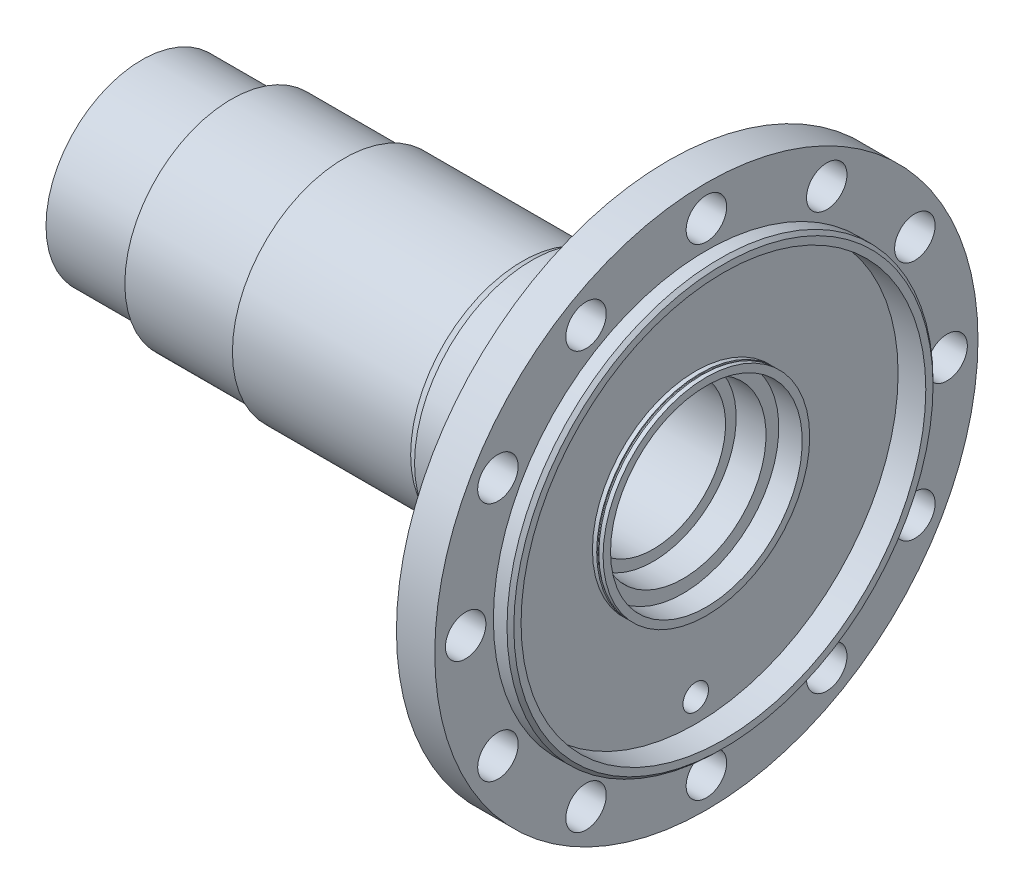
ISO-10303-21;
HEADER;
FILE_DESCRIPTION(('STEP AP214'),'2;1');
FILE_NAME('part.step','',(''),(''),'','','');
FILE_SCHEMA(('AUTOMOTIVE_DESIGN { 1 0 10303 214 1 1 1 1 }'));
ENDSEC;
DATA;
#1=APPLICATION_CONTEXT('core data for automotive mechanical design processes');
#2=APPLICATION_PROTOCOL_DEFINITION('international standard','automotive_design',2000,#1);
#3=PRODUCT_CONTEXT('',#1,'mechanical');
#4=PRODUCT('Part','Part','',(#3));
#5=PRODUCT_RELATED_PRODUCT_CATEGORY('part','',(#4));
#6=PRODUCT_DEFINITION_FORMATION('','',#4);
#7=PRODUCT_DEFINITION_CONTEXT('part definition',#1,'design');
#8=PRODUCT_DEFINITION('design','',#6,#7);
#9=PRODUCT_DEFINITION_SHAPE('','',#8);
#10=(LENGTH_UNIT() NAMED_UNIT(*) SI_UNIT(.MILLI.,.METRE.));
#11=(NAMED_UNIT(*) PLANE_ANGLE_UNIT() SI_UNIT($,.RADIAN.));
#12=(NAMED_UNIT(*) SI_UNIT($,.STERADIAN.) SOLID_ANGLE_UNIT());
#13=UNCERTAINTY_MEASURE_WITH_UNIT(LENGTH_MEASURE(1.E-05),#10,'distance_accuracy_value','');
#14=(GEOMETRIC_REPRESENTATION_CONTEXT(3) GLOBAL_UNCERTAINTY_ASSIGNED_CONTEXT((#13)) GLOBAL_UNIT_ASSIGNED_CONTEXT((#10,
#11,#12)) REPRESENTATION_CONTEXT('',''));
#15=CARTESIAN_POINT('',(0.,0.,0.));
#16=DIRECTION('',(0.,0.,1.));
#17=DIRECTION('',(1.,0.,0.));
#18=AXIS2_PLACEMENT_3D('',#15,#16,#17);
#19=CARTESIAN_POINT('',(265.,45.,0.));
#20=DIRECTION('',(1.,0.,0.));
#21=DIRECTION('',(0.,0.,-1.));
#22=AXIS2_PLACEMENT_3D('',#19,#20,#21);
#23=PLANE('',#22);
#24=CARTESIAN_POINT('',(265.,0.,0.));
#25=DIRECTION('',(-1.,0.,0.));
#26=DIRECTION('',(0.,0.,1.));
#27=AXIS2_PLACEMENT_3D('',#24,#25,#26);
#28=CIRCLE('',#27,45.);
#29=CARTESIAN_POINT('',(265.,0.,45.));
#30=VERTEX_POINT('',#29);
#31=EDGE_CURVE('E211',#30,#30,#28,.T.);
#32=ORIENTED_EDGE('',*,*,#31,.T.);
#33=EDGE_LOOP('',(#32));
#34=FACE_BOUND('',#33,.T.);
#35=CARTESIAN_POINT('',(265.,0.,0.));
#36=DIRECTION('',(-1.,0.,0.));
#37=DIRECTION('',(0.,0.,1.));
#38=AXIS2_PLACEMENT_3D('',#35,#36,#37);
#39=CIRCLE('',#38,48.5);
#40=CARTESIAN_POINT('',(265.,0.,48.5));
#41=VERTEX_POINT('',#40);
#42=EDGE_CURVE('E445',#41,#41,#39,.T.);
#43=ORIENTED_EDGE('',*,*,#42,.F.);
#44=EDGE_LOOP('',(#43));
#45=FACE_BOUND('',#44,.T.);
#46=ADVANCED_FACE('F50',(#34,#45),#23,.T.);
#47=CARTESIAN_POINT('',(0.,0.,0.));
#48=DIRECTION('',(1.,0.,0.));
#49=DIRECTION('',(0.,0.,-1.));
#50=AXIS2_PLACEMENT_3D('',#47,#48,#49);
#51=PLANE('',#50);
#52=CARTESIAN_POINT('',(0.,0.,0.));
#53=DIRECTION('',(-1.,0.,0.));
#54=DIRECTION('',(0.,0.,1.));
#55=AXIS2_PLACEMENT_3D('',#52,#53,#54);
#56=CIRCLE('',#55,31.);
#57=CARTESIAN_POINT('',(0.,0.,31.));
#58=VERTEX_POINT('',#57);
#59=EDGE_CURVE('E171',#58,#58,#56,.T.);
#60=ORIENTED_EDGE('',*,*,#59,.F.);
#61=EDGE_LOOP('',(#60));
#62=FACE_BOUND('',#61,.T.);
#63=CARTESIAN_POINT('',(0.,0.,0.));
#64=DIRECTION('',(-1.,0.,0.));
#65=DIRECTION('',(0.,0.,1.));
#66=AXIS2_PLACEMENT_3D('',#63,#64,#65);
#67=CIRCLE('',#66,45.);
#68=CARTESIAN_POINT('',(0.,0.,45.));
#69=VERTEX_POINT('',#68);
#70=EDGE_CURVE('E167',#69,#69,#67,.T.);
#71=ORIENTED_EDGE('',*,*,#70,.T.);
#72=EDGE_LOOP('',(#71));
#73=FACE_BOUND('',#72,.T.);
#74=ADVANCED_FACE('F53',(#62,#73),#51,.F.);
#75=CARTESIAN_POINT('',(273.,98.4,0.));
#76=DIRECTION('',(-1.,0.,0.));
#77=DIRECTION('',(0.,0.,1.));
#78=AXIS2_PLACEMENT_3D('',#75,#76,#77);
#79=PLANE('',#78);
#80=CARTESIAN_POINT('',(273.,0.,0.));
#81=DIRECTION('',(-1.,0.,0.));
#82=DIRECTION('',(0.,0.,1.));
#83=AXIS2_PLACEMENT_3D('',#80,#81,#82);
#84=CIRCLE('',#83,95.);
#85=CARTESIAN_POINT('',(273.,0.,95.));
#86=VERTEX_POINT('',#85);
#87=EDGE_CURVE('E215',#86,#86,#84,.T.);
#88=ORIENTED_EDGE('',*,*,#87,.T.);
#89=EDGE_LOOP('',(#88));
#90=FACE_BOUND('',#89,.T.);
#91=CARTESIAN_POINT('',(273.,0.,0.));
#92=DIRECTION('',(-1.,0.,0.));
#93=DIRECTION('',(0.,0.,1.));
#94=AXIS2_PLACEMENT_3D('',#91,#92,#93);
#95=CIRCLE('',#94,98.4);
#96=CARTESIAN_POINT('',(273.,0.,98.4));
#97=VERTEX_POINT('',#96);
#98=EDGE_CURVE('E11',#97,#97,#95,.T.);
#99=ORIENTED_EDGE('',*,*,#98,.F.);
#100=EDGE_LOOP('',(#99));
#101=FACE_BOUND('',#100,.T.);
#102=ADVANCED_FACE('F274',(#90,#101),#79,.F.);
#103=CARTESIAN_POINT('',(273.,0.,0.));
#104=DIRECTION('',(-1.,0.,0.));
#105=DIRECTION('',(0.,0.,1.));
#106=AXIS2_PLACEMENT_3D('',#103,#104,#105);
#107=CONICAL_SURFACE('',#106,98.4,0.785398163397435);
#108=CARTESIAN_POINT('',(271.4,0.,0.));
#109=DIRECTION('',(-1.,0.,0.));
#110=DIRECTION('',(0.,0.,1.));
#111=AXIS2_PLACEMENT_3D('',#108,#109,#110);
#112=CIRCLE('',#111,100.);
#113=CARTESIAN_POINT('',(271.4,0.,100.));
#114=VERTEX_POINT('',#113);
#115=EDGE_CURVE('E60',#114,#114,#112,.T.);
#116=ORIENTED_EDGE('',*,*,#115,.F.);
#117=EDGE_LOOP('',(#116));
#118=FACE_BOUND('',#117,.T.);
#119=ORIENTED_EDGE('',*,*,#98,.T.);
#120=EDGE_LOOP('',(#119));
#121=FACE_BOUND('',#120,.T.);
#122=ADVANCED_FACE('F400',(#118,#121),#107,.T.);
#123=CARTESIAN_POINT('',(0.,0.,0.));
#124=DIRECTION('',(-1.,0.,0.));
#125=DIRECTION('',(0.,0.,1.));
#126=AXIS2_PLACEMENT_3D('',#123,#124,#125);
#127=CYLINDRICAL_SURFACE('',#126,100.);
#128=CARTESIAN_POINT('',(265.,0.,0.));
#129=DIRECTION('',(-1.,0.,0.));
#130=DIRECTION('',(0.,0.,1.));
#131=AXIS2_PLACEMENT_3D('',#128,#129,#130);
#132=CIRCLE('',#131,100.);
#133=CARTESIAN_POINT('',(265.,0.,100.));
#134=VERTEX_POINT('',#133);
#135=EDGE_CURVE('E66',#134,#134,#132,.T.);
#136=ORIENTED_EDGE('',*,*,#135,.F.);
#137=EDGE_LOOP('',(#136));
#138=FACE_BOUND('',#137,.T.);
#139=ORIENTED_EDGE('',*,*,#115,.T.);
#140=EDGE_LOOP('',(#139));
#141=FACE_BOUND('',#140,.T.);
#142=ADVANCED_FACE('F395',(#138,#141),#127,.T.);
#143=CARTESIAN_POINT('',(265.,127.5,0.));
#144=DIRECTION('',(-1.,0.,0.));
#145=DIRECTION('',(0.,0.,1.));
#146=AXIS2_PLACEMENT_3D('',#143,#144,#145);
#147=PLANE('',#146);
#148=CARTESIAN_POINT('',(265.,97.8608706276416,-56.5));
#149=DIRECTION('',(-1.,0.,0.));
#150=DIRECTION('',(0.,0.,1.));
#151=AXIS2_PLACEMENT_3D('',#148,#149,#150);
#152=CIRCLE('',#151,9.5);
#153=CARTESIAN_POINT('',(265.,97.8608706276416,-47.));
#154=VERTEX_POINT('',#153);
#155=EDGE_CURVE('E506',#154,#154,#152,.F.);
#156=ORIENTED_EDGE('',*,*,#155,.F.);
#157=EDGE_LOOP('',(#156));
#158=FACE_BOUND('',#157,.T.);
#159=CARTESIAN_POINT('',(265.,56.4999999999999,-97.8608706276416));
#160=DIRECTION('',(-1.,0.,0.));
#161=DIRECTION('',(0.,0.,1.));
#162=AXIS2_PLACEMENT_3D('',#159,#160,#161);
#163=CIRCLE('',#162,9.49999999999999);
#164=CARTESIAN_POINT('',(265.,56.4999999999999,-88.3608706276416));
#165=VERTEX_POINT('',#164);
#166=EDGE_CURVE('E501',#165,#165,#163,.F.);
#167=ORIENTED_EDGE('',*,*,#166,.F.);
#168=EDGE_LOOP('',(#167));
#169=FACE_BOUND('',#168,.T.);
#170=CARTESIAN_POINT('',(265.,0.,-113.));
#171=DIRECTION('',(-1.,0.,0.));
#172=DIRECTION('',(0.,0.,1.));
#173=AXIS2_PLACEMENT_3D('',#170,#171,#172);
#174=CIRCLE('',#173,9.49999999999999);
#175=CARTESIAN_POINT('',(265.,0.,-103.5));
#176=VERTEX_POINT('',#175);
#177=EDGE_CURVE('E496',#176,#176,#174,.F.);
#178=ORIENTED_EDGE('',*,*,#177,.F.);
#179=EDGE_LOOP('',(#178));
#180=FACE_BOUND('',#179,.T.);
#181=CARTESIAN_POINT('',(265.,-56.5,-97.8608706276415));
#182=DIRECTION('',(-1.,0.,0.));
#183=DIRECTION('',(0.,0.,1.));
#184=AXIS2_PLACEMENT_3D('',#181,#182,#183);
#185=CIRCLE('',#184,9.49999999999999);
#186=CARTESIAN_POINT('',(265.,-56.5,-88.3608706276415));
#187=VERTEX_POINT('',#186);
#188=EDGE_CURVE('E491',#187,#187,#185,.F.);
#189=ORIENTED_EDGE('',*,*,#188,.F.);
#190=EDGE_LOOP('',(#189));
#191=FACE_BOUND('',#190,.T.);
#192=CARTESIAN_POINT('',(265.,-97.8608706276416,-56.5));
#193=DIRECTION('',(-1.,0.,0.));
#194=DIRECTION('',(0.,0.,1.));
#195=AXIS2_PLACEMENT_3D('',#192,#193,#194);
#196=CIRCLE('',#195,9.5);
#197=CARTESIAN_POINT('',(265.,-97.8608706276416,-47.));
#198=VERTEX_POINT('',#197);
#199=EDGE_CURVE('E486',#198,#198,#196,.F.);
#200=ORIENTED_EDGE('',*,*,#199,.F.);
#201=EDGE_LOOP('',(#200));
#202=FACE_BOUND('',#201,.T.);
#203=CARTESIAN_POINT('',(265.,-113.,0.));
#204=DIRECTION('',(-1.,0.,0.));
#205=DIRECTION('',(0.,0.,1.));
#206=AXIS2_PLACEMENT_3D('',#203,#204,#205);
#207=CIRCLE('',#206,9.5);
#208=CARTESIAN_POINT('',(265.,-113.,9.50000000000002));
#209=VERTEX_POINT('',#208);
#210=EDGE_CURVE('E481',#209,#209,#207,.F.);
#211=ORIENTED_EDGE('',*,*,#210,.F.);
#212=EDGE_LOOP('',(#211));
#213=FACE_BOUND('',#212,.T.);
#214=CARTESIAN_POINT('',(265.,-97.8608706276415,56.5));
#215=DIRECTION('',(-1.,0.,0.));
#216=DIRECTION('',(0.,0.,1.));
#217=AXIS2_PLACEMENT_3D('',#214,#215,#216);
#218=CIRCLE('',#217,9.5);
#219=CARTESIAN_POINT('',(265.,-97.8608706276415,66.0000000000001));
#220=VERTEX_POINT('',#219);
#221=EDGE_CURVE('E476',#220,#220,#218,.F.);
#222=ORIENTED_EDGE('',*,*,#221,.F.);
#223=EDGE_LOOP('',(#222));
#224=FACE_BOUND('',#223,.T.);
#225=CARTESIAN_POINT('',(265.,-56.5,97.8608706276416));
#226=DIRECTION('',(-1.,0.,0.));
#227=DIRECTION('',(0.,0.,1.));
#228=AXIS2_PLACEMENT_3D('',#225,#226,#227);
#229=CIRCLE('',#228,9.49999999999999);
#230=CARTESIAN_POINT('',(265.,-56.5,107.360870627642));
#231=VERTEX_POINT('',#230);
#232=EDGE_CURVE('E471',#231,#231,#229,.F.);
#233=ORIENTED_EDGE('',*,*,#232,.F.);
#234=EDGE_LOOP('',(#233));
#235=FACE_BOUND('',#234,.T.);
#236=CARTESIAN_POINT('',(265.,0.,113.));
#237=DIRECTION('',(-1.,0.,0.));
#238=DIRECTION('',(0.,0.,1.));
#239=AXIS2_PLACEMENT_3D('',#236,#237,#238);
#240=CIRCLE('',#239,9.49999999999999);
#241=CARTESIAN_POINT('',(265.,0.,122.5));
#242=VERTEX_POINT('',#241);
#243=EDGE_CURVE('E466',#242,#242,#240,.F.);
#244=ORIENTED_EDGE('',*,*,#243,.F.);
#245=EDGE_LOOP('',(#244));
#246=FACE_BOUND('',#245,.T.);
#247=CARTESIAN_POINT('',(265.,56.5,97.8608706276416));
#248=DIRECTION('',(-1.,0.,0.));
#249=DIRECTION('',(0.,0.,1.));
#250=AXIS2_PLACEMENT_3D('',#247,#248,#249);
#251=CIRCLE('',#250,9.49999999999999);
#252=CARTESIAN_POINT('',(265.,56.5,107.360870627642));
#253=VERTEX_POINT('',#252);
#254=EDGE_CURVE('E461',#253,#253,#251,.F.);
#255=ORIENTED_EDGE('',*,*,#254,.F.);
#256=EDGE_LOOP('',(#255));
#257=FACE_BOUND('',#256,.T.);
#258=CARTESIAN_POINT('',(265.,97.8608706276416,56.5));
#259=DIRECTION('',(-1.,0.,0.));
#260=DIRECTION('',(0.,0.,1.));
#261=AXIS2_PLACEMENT_3D('',#258,#259,#260);
#262=CIRCLE('',#261,9.5);
#263=CARTESIAN_POINT('',(265.,97.8608706276416,66.));
#264=VERTEX_POINT('',#263);
#265=EDGE_CURVE('E456',#264,#264,#262,.F.);
#266=ORIENTED_EDGE('',*,*,#265,.F.);
#267=EDGE_LOOP('',(#266));
#268=FACE_BOUND('',#267,.T.);
#269=CARTESIAN_POINT('',(265.,113.,0.));
#270=DIRECTION('',(-1.,0.,0.));
#271=DIRECTION('',(0.,0.,1.));
#272=AXIS2_PLACEMENT_3D('',#269,#270,#271);
#273=CIRCLE('',#272,9.5);
#274=CARTESIAN_POINT('',(265.,113.,9.49999999999999));
#275=VERTEX_POINT('',#274);
#276=EDGE_CURVE('E449',#275,#275,#273,.F.);
#277=ORIENTED_EDGE('',*,*,#276,.F.);
#278=EDGE_LOOP('',(#277));
#279=FACE_BOUND('',#278,.T.);
#280=CARTESIAN_POINT('',(265.,0.,0.));
#281=DIRECTION('',(-1.,0.,0.));
#282=DIRECTION('',(0.,0.,1.));
#283=AXIS2_PLACEMENT_3D('',#280,#281,#282);
#284=CIRCLE('',#283,127.5);
#285=CARTESIAN_POINT('',(265.,0.,127.5));
#286=VERTEX_POINT('',#285);
#287=EDGE_CURVE('E83',#286,#286,#284,.T.);
#288=ORIENTED_EDGE('',*,*,#287,.F.);
#289=EDGE_LOOP('',(#288));
#290=FACE_BOUND('',#289,.T.);
#291=ORIENTED_EDGE('',*,*,#135,.T.);
#292=EDGE_LOOP('',(#291));
#293=FACE_BOUND('',#292,.T.);
#294=ADVANCED_FACE('F390',(#158,#169,#180,#191,#202,#213,#224,#235,#246,#257,#268,#279,#290,
#293),#147,.F.);
#295=CARTESIAN_POINT('',(0.,0.,0.));
#296=DIRECTION('',(-1.,0.,0.));
#297=DIRECTION('',(0.,0.,1.));
#298=AXIS2_PLACEMENT_3D('',#295,#296,#297);
#299=CYLINDRICAL_SURFACE('',#298,127.5);
#300=CARTESIAN_POINT('',(247.,0.,0.));
#301=DIRECTION('',(-1.,0.,0.));
#302=DIRECTION('',(0.,0.,1.));
#303=AXIS2_PLACEMENT_3D('',#300,#301,#302);
#304=CIRCLE('',#303,127.5);
#305=CARTESIAN_POINT('',(247.,0.,127.5));
#306=VERTEX_POINT('',#305);
#307=EDGE_CURVE('E88',#306,#306,#304,.T.);
#308=ORIENTED_EDGE('',*,*,#307,.F.);
#309=EDGE_LOOP('',(#308));
#310=FACE_BOUND('',#309,.T.);
#311=ORIENTED_EDGE('',*,*,#287,.T.);
#312=EDGE_LOOP('',(#311));
#313=FACE_BOUND('',#312,.T.);
#314=ADVANCED_FACE('F385',(#310,#313),#299,.T.);
#315=CARTESIAN_POINT('',(247.,100.,0.));
#316=DIRECTION('',(1.,0.,0.));
#317=DIRECTION('',(0.,0.,-1.));
#318=AXIS2_PLACEMENT_3D('',#315,#316,#317);
#319=PLANE('',#318);
#320=CARTESIAN_POINT('',(247.,97.8608706276416,-56.5));
#321=DIRECTION('',(1.,0.,0.));
#322=DIRECTION('',(0.,0.,-1.));
#323=AXIS2_PLACEMENT_3D('',#320,#321,#322);
#324=CIRCLE('',#323,9.5);
#325=CARTESIAN_POINT('',(247.,97.8608706276416,-66.));
#326=VERTEX_POINT('',#325);
#327=EDGE_CURVE('E510',#326,#326,#324,.F.);
#328=ORIENTED_EDGE('',*,*,#327,.F.);
#329=EDGE_LOOP('',(#328));
#330=FACE_BOUND('',#329,.T.);
#331=CARTESIAN_POINT('',(247.,56.4999999999999,-97.8608706276416));
#332=DIRECTION('',(1.,0.,0.));
#333=DIRECTION('',(0.,0.,-1.));
#334=AXIS2_PLACEMENT_3D('',#331,#332,#333);
#335=CIRCLE('',#334,9.49999999999999);
#336=CARTESIAN_POINT('',(247.,56.4999999999999,-107.360870627642));
#337=VERTEX_POINT('',#336);
#338=EDGE_CURVE('E505',#337,#337,#335,.F.);
#339=ORIENTED_EDGE('',*,*,#338,.F.);
#340=EDGE_LOOP('',(#339));
#341=FACE_BOUND('',#340,.T.);
#342=CARTESIAN_POINT('',(247.,0.,-113.));
#343=DIRECTION('',(1.,0.,0.));
#344=DIRECTION('',(0.,0.,-1.));
#345=AXIS2_PLACEMENT_3D('',#342,#343,#344);
#346=CIRCLE('',#345,9.49999999999999);
#347=CARTESIAN_POINT('',(247.,0.,-122.5));
#348=VERTEX_POINT('',#347);
#349=EDGE_CURVE('E500',#348,#348,#346,.F.);
#350=ORIENTED_EDGE('',*,*,#349,.F.);
#351=EDGE_LOOP('',(#350));
#352=FACE_BOUND('',#351,.T.);
#353=CARTESIAN_POINT('',(247.,-56.5,-97.8608706276415));
#354=DIRECTION('',(1.,0.,0.));
#355=DIRECTION('',(0.,0.,-1.));
#356=AXIS2_PLACEMENT_3D('',#353,#354,#355);
#357=CIRCLE('',#356,9.49999999999999);
#358=CARTESIAN_POINT('',(247.,-56.5,-107.360870627642));
#359=VERTEX_POINT('',#358);
#360=EDGE_CURVE('E495',#359,#359,#357,.F.);
#361=ORIENTED_EDGE('',*,*,#360,.F.);
#362=EDGE_LOOP('',(#361));
#363=FACE_BOUND('',#362,.T.);
#364=CARTESIAN_POINT('',(247.,-97.8608706276416,-56.5));
#365=DIRECTION('',(1.,0.,0.));
#366=DIRECTION('',(0.,0.,-1.));
#367=AXIS2_PLACEMENT_3D('',#364,#365,#366);
#368=CIRCLE('',#367,9.5);
#369=CARTESIAN_POINT('',(247.,-97.8608706276416,-66.));
#370=VERTEX_POINT('',#369);
#371=EDGE_CURVE('E490',#370,#370,#368,.F.);
#372=ORIENTED_EDGE('',*,*,#371,.F.);
#373=EDGE_LOOP('',(#372));
#374=FACE_BOUND('',#373,.T.);
#375=CARTESIAN_POINT('',(247.,-113.,0.));
#376=DIRECTION('',(1.,0.,0.));
#377=DIRECTION('',(0.,0.,-1.));
#378=AXIS2_PLACEMENT_3D('',#375,#376,#377);
#379=CIRCLE('',#378,9.5);
#380=CARTESIAN_POINT('',(247.,-113.,-9.49999999999998));
#381=VERTEX_POINT('',#380);
#382=EDGE_CURVE('E485',#381,#381,#379,.F.);
#383=ORIENTED_EDGE('',*,*,#382,.F.);
#384=EDGE_LOOP('',(#383));
#385=FACE_BOUND('',#384,.T.);
#386=CARTESIAN_POINT('',(247.,-97.8608706276415,56.5));
#387=DIRECTION('',(1.,0.,0.));
#388=DIRECTION('',(0.,0.,-1.));
#389=AXIS2_PLACEMENT_3D('',#386,#387,#388);
#390=CIRCLE('',#389,9.5);
#391=CARTESIAN_POINT('',(247.,-97.8608706276415,47.));
#392=VERTEX_POINT('',#391);
#393=EDGE_CURVE('E480',#392,#392,#390,.F.);
#394=ORIENTED_EDGE('',*,*,#393,.F.);
#395=EDGE_LOOP('',(#394));
#396=FACE_BOUND('',#395,.T.);
#397=CARTESIAN_POINT('',(247.,-56.5,97.8608706276416));
#398=DIRECTION('',(1.,0.,0.));
#399=DIRECTION('',(0.,0.,-1.));
#400=AXIS2_PLACEMENT_3D('',#397,#398,#399);
#401=CIRCLE('',#400,9.49999999999999);
#402=CARTESIAN_POINT('',(247.,-56.5,88.3608706276416));
#403=VERTEX_POINT('',#402);
#404=EDGE_CURVE('E475',#403,#403,#401,.F.);
#405=ORIENTED_EDGE('',*,*,#404,.F.);
#406=EDGE_LOOP('',(#405));
#407=FACE_BOUND('',#406,.T.);
#408=CARTESIAN_POINT('',(247.,0.,113.));
#409=DIRECTION('',(1.,0.,0.));
#410=DIRECTION('',(0.,0.,-1.));
#411=AXIS2_PLACEMENT_3D('',#408,#409,#410);
#412=CIRCLE('',#411,9.49999999999999);
#413=CARTESIAN_POINT('',(247.,0.,103.5));
#414=VERTEX_POINT('',#413);
#415=EDGE_CURVE('E470',#414,#414,#412,.F.);
#416=ORIENTED_EDGE('',*,*,#415,.F.);
#417=EDGE_LOOP('',(#416));
#418=FACE_BOUND('',#417,.T.);
#419=CARTESIAN_POINT('',(247.,56.5,97.8608706276416));
#420=DIRECTION('',(1.,0.,0.));
#421=DIRECTION('',(0.,0.,-1.));
#422=AXIS2_PLACEMENT_3D('',#419,#420,#421);
#423=CIRCLE('',#422,9.49999999999999);
#424=CARTESIAN_POINT('',(247.,56.5,88.3608706276416));
#425=VERTEX_POINT('',#424);
#426=EDGE_CURVE('E465',#425,#425,#423,.F.);
#427=ORIENTED_EDGE('',*,*,#426,.F.);
#428=EDGE_LOOP('',(#427));
#429=FACE_BOUND('',#428,.T.);
#430=CARTESIAN_POINT('',(247.,97.8608706276416,56.5));
#431=DIRECTION('',(1.,0.,0.));
#432=DIRECTION('',(0.,0.,-1.));
#433=AXIS2_PLACEMENT_3D('',#430,#431,#432);
#434=CIRCLE('',#433,9.5);
#435=CARTESIAN_POINT('',(247.,97.8608706276416,47.));
#436=VERTEX_POINT('',#435);
#437=EDGE_CURVE('E460',#436,#436,#434,.F.);
#438=ORIENTED_EDGE('',*,*,#437,.F.);
#439=EDGE_LOOP('',(#438));
#440=FACE_BOUND('',#439,.T.);
#441=CARTESIAN_POINT('',(247.,113.,0.));
#442=DIRECTION('',(1.,0.,0.));
#443=DIRECTION('',(0.,0.,-1.));
#444=AXIS2_PLACEMENT_3D('',#441,#442,#443);
#445=CIRCLE('',#444,9.5);
#446=CARTESIAN_POINT('',(247.,113.,-9.50000000000001));
#447=VERTEX_POINT('',#446);
#448=EDGE_CURVE('E72',#447,#447,#445,.F.);
#449=ORIENTED_EDGE('',*,*,#448,.F.);
#450=EDGE_LOOP('',(#449));
#451=FACE_BOUND('',#450,.T.);
#452=CARTESIAN_POINT('',(247.,0.,0.));
#453=DIRECTION('',(-1.,0.,0.));
#454=DIRECTION('',(0.,0.,1.));
#455=AXIS2_PLACEMENT_3D('',#452,#453,#454);
#456=CIRCLE('',#455,100.);
#457=CARTESIAN_POINT('',(247.,0.,100.));
#458=VERTEX_POINT('',#457);
#459=EDGE_CURVE('E93',#458,#458,#456,.T.);
#460=ORIENTED_EDGE('',*,*,#459,.F.);
#461=EDGE_LOOP('',(#460));
#462=FACE_BOUND('',#461,.T.);
#463=ORIENTED_EDGE('',*,*,#307,.T.);
#464=EDGE_LOOP('',(#463));
#465=FACE_BOUND('',#464,.T.);
#466=ADVANCED_FACE('F380',(#330,#341,#352,#363,#374,#385,#396,#407,#418,#429,#440,#451,#462,
#465),#319,.F.);
#467=CARTESIAN_POINT('',(0.,0.,0.));
#468=DIRECTION('',(-1.,0.,0.));
#469=DIRECTION('',(0.,0.,1.));
#470=AXIS2_PLACEMENT_3D('',#467,#468,#469);
#471=CYLINDRICAL_SURFACE('',#470,100.);
#472=CARTESIAN_POINT('',(239.,0.,0.));
#473=DIRECTION('',(-1.,0.,0.));
#474=DIRECTION('',(0.,0.,1.));
#475=AXIS2_PLACEMENT_3D('',#472,#473,#474);
#476=CIRCLE('',#475,100.);
#477=CARTESIAN_POINT('',(239.,0.,100.));
#478=VERTEX_POINT('',#477);
#479=EDGE_CURVE('E101',#478,#478,#476,.T.);
#480=ORIENTED_EDGE('',*,*,#479,.F.);
#481=EDGE_LOOP('',(#480));
#482=FACE_BOUND('',#481,.T.);
#483=ORIENTED_EDGE('',*,*,#459,.T.);
#484=EDGE_LOOP('',(#483));
#485=FACE_BOUND('',#484,.T.);
#486=ADVANCED_FACE('F375',(#482,#485),#471,.T.);
#487=CARTESIAN_POINT('',(239.,62.5,0.));
#488=DIRECTION('',(1.,0.,0.));
#489=DIRECTION('',(0.,0.,-1.));
#490=AXIS2_PLACEMENT_3D('',#487,#488,#489);
#491=PLANE('',#490);
#492=CARTESIAN_POINT('',(239.,-84.,0.));
#493=DIRECTION('',(1.,0.,0.));
#494=DIRECTION('',(0.,0.,-1.));
#495=AXIS2_PLACEMENT_3D('',#492,#493,#494);
#496=CIRCLE('',#495,6.);
#497=CARTESIAN_POINT('',(239.,-84.,-6.));
#498=VERTEX_POINT('',#497);
#499=EDGE_CURVE('E511',#498,#498,#496,.F.);
#500=ORIENTED_EDGE('',*,*,#499,.F.);
#501=EDGE_LOOP('',(#500));
#502=FACE_BOUND('',#501,.T.);
#503=CARTESIAN_POINT('',(239.,0.,0.));
#504=DIRECTION('',(-1.,0.,0.));
#505=DIRECTION('',(0.,0.,1.));
#506=AXIS2_PLACEMENT_3D('',#503,#504,#505);
#507=CIRCLE('',#506,62.5);
#508=CARTESIAN_POINT('',(239.,0.,62.5));
#509=VERTEX_POINT('',#508);
#510=EDGE_CURVE('E105',#509,#509,#507,.T.);
#511=ORIENTED_EDGE('',*,*,#510,.F.);
#512=EDGE_LOOP('',(#511));
#513=FACE_BOUND('',#512,.T.);
#514=ORIENTED_EDGE('',*,*,#479,.T.);
#515=EDGE_LOOP('',(#514));
#516=FACE_BOUND('',#515,.T.);
#517=ADVANCED_FACE('F370',(#502,#513,#516),#491,.F.);
#518=CARTESIAN_POINT('',(0.,0.,0.));
#519=DIRECTION('',(-1.,0.,0.));
#520=DIRECTION('',(0.,0.,1.));
#521=AXIS2_PLACEMENT_3D('',#518,#519,#520);
#522=CYLINDRICAL_SURFACE('',#521,62.5);
#523=CARTESIAN_POINT('',(218.,0.,0.));
#524=DIRECTION('',(-1.,0.,0.));
#525=DIRECTION('',(0.,0.,1.));
#526=AXIS2_PLACEMENT_3D('',#523,#524,#525);
#527=CIRCLE('',#526,62.5);
#528=CARTESIAN_POINT('',(218.,0.,62.5));
#529=VERTEX_POINT('',#528);
#530=EDGE_CURVE('E110',#529,#529,#527,.T.);
#531=ORIENTED_EDGE('',*,*,#530,.F.);
#532=EDGE_LOOP('',(#531));
#533=FACE_BOUND('',#532,.T.);
#534=ORIENTED_EDGE('',*,*,#510,.T.);
#535=EDGE_LOOP('',(#534));
#536=FACE_BOUND('',#535,.T.);
#537=ADVANCED_FACE('F365',(#533,#536),#522,.T.);
#538=CARTESIAN_POINT('',(218.,0.,0.));
#539=DIRECTION('',(1.,0.,0.));
#540=DIRECTION('',(0.,0.,-1.));
#541=AXIS2_PLACEMENT_3D('',#538,#539,#540);
#542=CONICAL_SURFACE('',#541,62.5,0.523598775598297);
#543=CARTESIAN_POINT('',(215.,0.,0.));
#544=DIRECTION('',(-1.,0.,0.));
#545=DIRECTION('',(0.,0.,1.));
#546=AXIS2_PLACEMENT_3D('',#543,#544,#545);
#547=CIRCLE('',#546,60.7679491924311);
#548=CARTESIAN_POINT('',(215.,0.,60.7679491924311));
#549=VERTEX_POINT('',#548);
#550=EDGE_CURVE('E115',#549,#549,#547,.T.);
#551=ORIENTED_EDGE('',*,*,#550,.F.);
#552=EDGE_LOOP('',(#551));
#553=FACE_BOUND('',#552,.T.);
#554=ORIENTED_EDGE('',*,*,#530,.T.);
#555=EDGE_LOOP('',(#554));
#556=FACE_BOUND('',#555,.T.);
#557=ADVANCED_FACE('F360',(#553,#556),#542,.T.);
#558=CARTESIAN_POINT('',(215.,57.,0.));
#559=DIRECTION('',(1.,0.,0.));
#560=DIRECTION('',(0.,0.,-1.));
#561=AXIS2_PLACEMENT_3D('',#558,#559,#560);
#562=PLANE('',#561);
#563=CARTESIAN_POINT('',(215.,0.,0.));
#564=DIRECTION('',(-1.,0.,0.));
#565=DIRECTION('',(0.,0.,1.));
#566=AXIS2_PLACEMENT_3D('',#563,#564,#565);
#567=CIRCLE('',#566,57.);
#568=CARTESIAN_POINT('',(215.,0.,57.));
#569=VERTEX_POINT('',#568);
#570=EDGE_CURVE('E123',#569,#569,#567,.T.);
#571=ORIENTED_EDGE('',*,*,#570,.F.);
#572=EDGE_LOOP('',(#571));
#573=FACE_BOUND('',#572,.T.);
#574=ORIENTED_EDGE('',*,*,#550,.T.);
#575=EDGE_LOOP('',(#574));
#576=FACE_BOUND('',#575,.T.);
#577=ADVANCED_FACE('F355',(#573,#576),#562,.F.);
#578=CARTESIAN_POINT('',(213.,0.,0.));
#579=DIRECTION('',(-1.,0.,0.));
#580=DIRECTION('',(0.,0.,1.));
#581=AXIS2_PLACEMENT_3D('',#578,#579,#580);
#582=TOROIDAL_SURFACE('',#581,57.,1.99999999999997);
#583=CARTESIAN_POINT('',(213.,0.,0.));
#584=DIRECTION('',(-1.,0.,0.));
#585=DIRECTION('',(0.,0.,1.));
#586=AXIS2_PLACEMENT_3D('',#583,#584,#585);
#587=CIRCLE('',#586,55.);
#588=CARTESIAN_POINT('',(213.,0.,55.));
#589=VERTEX_POINT('',#588);
#590=EDGE_CURVE('E127',#589,#589,#587,.T.);
#591=ORIENTED_EDGE('',*,*,#590,.F.);
#592=EDGE_LOOP('',(#591));
#593=FACE_BOUND('',#592,.T.);
#594=ORIENTED_EDGE('',*,*,#570,.T.);
#595=EDGE_LOOP('',(#594));
#596=FACE_BOUND('',#595,.T.);
#597=ADVANCED_FACE('F350',(#593,#596),#582,.F.);
#598=CARTESIAN_POINT('',(0.,0.,0.));
#599=DIRECTION('',(-1.,0.,0.));
#600=DIRECTION('',(0.,0.,1.));
#601=AXIS2_PLACEMENT_3D('',#598,#599,#600);
#602=CYLINDRICAL_SURFACE('',#601,55.);
#603=CARTESIAN_POINT('',(183.,0.,0.));
#604=DIRECTION('',(-1.,0.,0.));
#605=DIRECTION('',(0.,0.,1.));
#606=AXIS2_PLACEMENT_3D('',#603,#604,#605);
#607=CIRCLE('',#606,55.);
#608=CARTESIAN_POINT('',(183.,0.,55.));
#609=VERTEX_POINT('',#608);
#610=EDGE_CURVE('E132',#609,#609,#607,.T.);
#611=ORIENTED_EDGE('',*,*,#610,.F.);
#612=EDGE_LOOP('',(#611));
#613=FACE_BOUND('',#612,.T.);
#614=ORIENTED_EDGE('',*,*,#590,.T.);
#615=EDGE_LOOP('',(#614));
#616=FACE_BOUND('',#615,.T.);
#617=ADVANCED_FACE('F345',(#613,#616),#602,.T.);
#618=CARTESIAN_POINT('',(183.,0.,0.));
#619=DIRECTION('',(1.,0.,0.));
#620=DIRECTION('',(0.,0.,-1.));
#621=AXIS2_PLACEMENT_3D('',#618,#619,#620);
#622=CONICAL_SURFACE('',#621,55.,0.5235987755983);
#623=CARTESIAN_POINT('',(178.669872981078,0.,0.));
#624=DIRECTION('',(-1.,0.,0.));
#625=DIRECTION('',(0.,0.,1.));
#626=AXIS2_PLACEMENT_3D('',#623,#624,#625);
#627=CIRCLE('',#626,52.5);
#628=CARTESIAN_POINT('',(178.669872981078,0.,52.5));
#629=VERTEX_POINT('',#628);
#630=EDGE_CURVE('E137',#629,#629,#627,.T.);
#631=ORIENTED_EDGE('',*,*,#630,.F.);
#632=EDGE_LOOP('',(#631));
#633=FACE_BOUND('',#632,.T.);
#634=ORIENTED_EDGE('',*,*,#610,.T.);
#635=EDGE_LOOP('',(#634));
#636=FACE_BOUND('',#635,.T.);
#637=ADVANCED_FACE('F340',(#633,#636),#622,.T.);
#638=CARTESIAN_POINT('',(0.,0.,0.));
#639=DIRECTION('',(-1.,0.,0.));
#640=DIRECTION('',(0.,0.,1.));
#641=AXIS2_PLACEMENT_3D('',#638,#639,#640);
#642=CYLINDRICAL_SURFACE('',#641,52.5);
#643=CARTESIAN_POINT('',(95.,0.,0.));
#644=DIRECTION('',(-1.,0.,0.));
#645=DIRECTION('',(0.,0.,1.));
#646=AXIS2_PLACEMENT_3D('',#643,#644,#645);
#647=CIRCLE('',#646,52.5);
#648=CARTESIAN_POINT('',(95.,0.,52.5));
#649=VERTEX_POINT('',#648);
#650=EDGE_CURVE('E145',#649,#649,#647,.T.);
#651=ORIENTED_EDGE('',*,*,#650,.F.);
#652=EDGE_LOOP('',(#651));
#653=FACE_BOUND('',#652,.T.);
#654=ORIENTED_EDGE('',*,*,#630,.T.);
#655=EDGE_LOOP('',(#654));
#656=FACE_BOUND('',#655,.T.);
#657=ADVANCED_FACE('F335',(#653,#656),#642,.T.);
#658=CARTESIAN_POINT('',(95.,50.,0.));
#659=DIRECTION('',(1.,0.,0.));
#660=DIRECTION('',(0.,0.,-1.));
#661=AXIS2_PLACEMENT_3D('',#658,#659,#660);
#662=PLANE('',#661);
#663=CARTESIAN_POINT('',(95.,0.,0.));
#664=DIRECTION('',(-1.,0.,0.));
#665=DIRECTION('',(0.,0.,1.));
#666=AXIS2_PLACEMENT_3D('',#663,#664,#665);
#667=CIRCLE('',#666,50.);
#668=CARTESIAN_POINT('',(95.,0.,50.));
#669=VERTEX_POINT('',#668);
#670=EDGE_CURVE('E149',#669,#669,#667,.T.);
#671=ORIENTED_EDGE('',*,*,#670,.F.);
#672=EDGE_LOOP('',(#671));
#673=FACE_BOUND('',#672,.T.);
#674=ORIENTED_EDGE('',*,*,#650,.T.);
#675=EDGE_LOOP('',(#674));
#676=FACE_BOUND('',#675,.T.);
#677=ADVANCED_FACE('F330',(#673,#676),#662,.F.);
#678=CARTESIAN_POINT('',(0.,0.,0.));
#679=DIRECTION('',(-1.,0.,0.));
#680=DIRECTION('',(0.,0.,1.));
#681=AXIS2_PLACEMENT_3D('',#678,#679,#680);
#682=CYLINDRICAL_SURFACE('',#681,50.);
#683=CARTESIAN_POINT('',(42.,0.,0.));
#684=DIRECTION('',(-1.,0.,0.));
#685=DIRECTION('',(0.,0.,1.));
#686=AXIS2_PLACEMENT_3D('',#683,#684,#685);
#687=CIRCLE('',#686,50.);
#688=CARTESIAN_POINT('',(42.,0.,50.));
#689=VERTEX_POINT('',#688);
#690=EDGE_CURVE('E154',#689,#689,#687,.T.);
#691=ORIENTED_EDGE('',*,*,#690,.F.);
#692=EDGE_LOOP('',(#691));
#693=FACE_BOUND('',#692,.T.);
#694=ORIENTED_EDGE('',*,*,#670,.T.);
#695=EDGE_LOOP('',(#694));
#696=FACE_BOUND('',#695,.T.);
#697=ADVANCED_FACE('F325',(#693,#696),#682,.T.);
#698=CARTESIAN_POINT('',(42.,45.,0.));
#699=DIRECTION('',(1.,0.,0.));
#700=DIRECTION('',(0.,0.,-1.));
#701=AXIS2_PLACEMENT_3D('',#698,#699,#700);
#702=PLANE('',#701);
#703=CARTESIAN_POINT('',(42.,0.,0.));
#704=DIRECTION('',(-1.,0.,0.));
#705=DIRECTION('',(0.,0.,1.));
#706=AXIS2_PLACEMENT_3D('',#703,#704,#705);
#707=CIRCLE('',#706,45.);
#708=CARTESIAN_POINT('',(42.,0.,45.));
#709=VERTEX_POINT('',#708);
#710=EDGE_CURVE('E159',#709,#709,#707,.T.);
#711=ORIENTED_EDGE('',*,*,#710,.F.);
#712=EDGE_LOOP('',(#711));
#713=FACE_BOUND('',#712,.T.);
#714=ORIENTED_EDGE('',*,*,#690,.T.);
#715=EDGE_LOOP('',(#714));
#716=FACE_BOUND('',#715,.T.);
#717=ADVANCED_FACE('F320',(#713,#716),#702,.F.);
#718=CARTESIAN_POINT('',(0.,0.,0.));
#719=DIRECTION('',(-1.,0.,0.));
#720=DIRECTION('',(0.,0.,1.));
#721=AXIS2_PLACEMENT_3D('',#718,#719,#720);
#722=CYLINDRICAL_SURFACE('',#721,45.);
#723=ORIENTED_EDGE('',*,*,#70,.F.);
#724=EDGE_LOOP('',(#723));
#725=FACE_BOUND('',#724,.T.);
#726=ORIENTED_EDGE('',*,*,#710,.T.);
#727=EDGE_LOOP('',(#726));
#728=FACE_BOUND('',#727,.T.);
#729=ADVANCED_FACE('F315',(#725,#728),#722,.T.);
#730=CARTESIAN_POINT('',(0.,0.,0.));
#731=DIRECTION('',(-1.,0.,0.));
#732=DIRECTION('',(0.,0.,1.));
#733=AXIS2_PLACEMENT_3D('',#730,#731,#732);
#734=CYLINDRICAL_SURFACE('',#733,31.);
#735=ORIENTED_EDGE('',*,*,#59,.T.);
#736=EDGE_LOOP('',(#735));
#737=FACE_BOUND('',#736,.T.);
#738=CARTESIAN_POINT('',(203.5,0.,0.));
#739=DIRECTION('',(-1.,0.,0.));
#740=DIRECTION('',(0.,0.,1.));
#741=AXIS2_PLACEMENT_3D('',#738,#739,#740);
#742=CIRCLE('',#741,31.);
#743=CARTESIAN_POINT('',(203.5,0.,31.));
#744=VERTEX_POINT('',#743);
#745=EDGE_CURVE('E176',#744,#744,#742,.T.);
#746=ORIENTED_EDGE('',*,*,#745,.F.);
#747=EDGE_LOOP('',(#746));
#748=FACE_BOUND('',#747,.T.);
#749=ADVANCED_FACE('F310',(#737,#748),#734,.F.);
#750=CARTESIAN_POINT('',(203.5,31.,0.));
#751=DIRECTION('',(1.,0.,0.));
#752=DIRECTION('',(0.,0.,-1.));
#753=AXIS2_PLACEMENT_3D('',#750,#751,#752);
#754=PLANE('',#753);
#755=ORIENTED_EDGE('',*,*,#745,.T.);
#756=EDGE_LOOP('',(#755));
#757=FACE_BOUND('',#756,.T.);
#758=CARTESIAN_POINT('',(203.5,0.,0.));
#759=DIRECTION('',(-1.,0.,0.));
#760=DIRECTION('',(0.,0.,1.));
#761=AXIS2_PLACEMENT_3D('',#758,#759,#760);
#762=CIRCLE('',#761,34.);
#763=CARTESIAN_POINT('',(203.5,0.,34.));
#764=VERTEX_POINT('',#763);
#765=EDGE_CURVE('E181',#764,#764,#762,.T.);
#766=ORIENTED_EDGE('',*,*,#765,.F.);
#767=EDGE_LOOP('',(#766));
#768=FACE_BOUND('',#767,.T.);
#769=ADVANCED_FACE('F305',(#757,#768),#754,.T.);
#770=CARTESIAN_POINT('',(0.,0.,0.));
#771=DIRECTION('',(-1.,0.,0.));
#772=DIRECTION('',(0.,0.,1.));
#773=AXIS2_PLACEMENT_3D('',#770,#771,#772);
#774=CYLINDRICAL_SURFACE('',#773,34.);
#775=ORIENTED_EDGE('',*,*,#765,.T.);
#776=EDGE_LOOP('',(#775));
#777=FACE_BOUND('',#776,.T.);
#778=CARTESIAN_POINT('',(240.,0.,0.));
#779=DIRECTION('',(-1.,0.,0.));
#780=DIRECTION('',(0.,0.,1.));
#781=AXIS2_PLACEMENT_3D('',#778,#779,#780);
#782=CIRCLE('',#781,34.);
#783=CARTESIAN_POINT('',(240.,0.,34.));
#784=VERTEX_POINT('',#783);
#785=EDGE_CURVE('E189',#784,#784,#782,.T.);
#786=ORIENTED_EDGE('',*,*,#785,.F.);
#787=EDGE_LOOP('',(#786));
#788=FACE_BOUND('',#787,.T.);
#789=ADVANCED_FACE('F300',(#777,#788),#774,.F.);
#790=CARTESIAN_POINT('',(240.,34.,0.));
#791=DIRECTION('',(1.,0.,0.));
#792=DIRECTION('',(0.,0.,-1.));
#793=AXIS2_PLACEMENT_3D('',#790,#791,#792);
#794=PLANE('',#793);
#795=ORIENTED_EDGE('',*,*,#785,.T.);
#796=EDGE_LOOP('',(#795));
#797=FACE_BOUND('',#796,.T.);
#798=CARTESIAN_POINT('',(240.,0.,0.));
#799=DIRECTION('',(-1.,0.,0.));
#800=DIRECTION('',(0.,0.,1.));
#801=AXIS2_PLACEMENT_3D('',#798,#799,#800);
#802=CIRCLE('',#801,39.);
#803=CARTESIAN_POINT('',(240.,0.,39.));
#804=VERTEX_POINT('',#803);
#805=EDGE_CURVE('E193',#804,#804,#802,.T.);
#806=ORIENTED_EDGE('',*,*,#805,.F.);
#807=EDGE_LOOP('',(#806));
#808=FACE_BOUND('',#807,.T.);
#809=ADVANCED_FACE('F295',(#797,#808),#794,.T.);
#810=CARTESIAN_POINT('',(0.,0.,0.));
#811=DIRECTION('',(-1.,0.,0.));
#812=DIRECTION('',(0.,0.,1.));
#813=AXIS2_PLACEMENT_3D('',#810,#811,#812);
#814=CYLINDRICAL_SURFACE('',#813,39.);
#815=ORIENTED_EDGE('',*,*,#805,.T.);
#816=EDGE_LOOP('',(#815));
#817=FACE_BOUND('',#816,.T.);
#818=CARTESIAN_POINT('',(254.,0.,0.));
#819=DIRECTION('',(-1.,0.,0.));
#820=DIRECTION('',(0.,0.,1.));
#821=AXIS2_PLACEMENT_3D('',#818,#819,#820);
#822=CIRCLE('',#821,39.);
#823=CARTESIAN_POINT('',(254.,0.,39.));
#824=VERTEX_POINT('',#823);
#825=EDGE_CURVE('E198',#824,#824,#822,.T.);
#826=ORIENTED_EDGE('',*,*,#825,.F.);
#827=EDGE_LOOP('',(#826));
#828=FACE_BOUND('',#827,.T.);
#829=ADVANCED_FACE('F290',(#817,#828),#814,.F.);
#830=CARTESIAN_POINT('',(254.,39.,0.));
#831=DIRECTION('',(1.,0.,0.));
#832=DIRECTION('',(0.,0.,-1.));
#833=AXIS2_PLACEMENT_3D('',#830,#831,#832);
#834=PLANE('',#833);
#835=ORIENTED_EDGE('',*,*,#825,.T.);
#836=EDGE_LOOP('',(#835));
#837=FACE_BOUND('',#836,.T.);
#838=CARTESIAN_POINT('',(254.,0.,0.));
#839=DIRECTION('',(-1.,0.,0.));
#840=DIRECTION('',(0.,0.,1.));
#841=AXIS2_PLACEMENT_3D('',#838,#839,#840);
#842=CIRCLE('',#841,45.);
#843=CARTESIAN_POINT('',(254.,0.,45.));
#844=VERTEX_POINT('',#843);
#845=EDGE_CURVE('E203',#844,#844,#842,.T.);
#846=ORIENTED_EDGE('',*,*,#845,.F.);
#847=EDGE_LOOP('',(#846));
#848=FACE_BOUND('',#847,.T.);
#849=ADVANCED_FACE('F285',(#837,#848),#834,.T.);
#850=CARTESIAN_POINT('',(0.,0.,0.));
#851=DIRECTION('',(-1.,0.,0.));
#852=DIRECTION('',(0.,0.,1.));
#853=AXIS2_PLACEMENT_3D('',#850,#851,#852);
#854=CYLINDRICAL_SURFACE('',#853,45.);
#855=ORIENTED_EDGE('',*,*,#845,.T.);
#856=EDGE_LOOP('',(#855));
#857=FACE_BOUND('',#856,.T.);
#858=ORIENTED_EDGE('',*,*,#31,.F.);
#859=EDGE_LOOP('',(#858));
#860=FACE_BOUND('',#859,.T.);
#861=ADVANCED_FACE('F281',(#857,#860),#854,.F.);
#862=CARTESIAN_POINT('',(0.,0.,0.));
#863=DIRECTION('',(-1.,0.,0.));
#864=DIRECTION('',(0.,0.,1.));
#865=AXIS2_PLACEMENT_3D('',#862,#863,#864);
#866=CYLINDRICAL_SURFACE('',#865,95.);
#867=ORIENTED_EDGE('',*,*,#87,.F.);
#868=EDGE_LOOP('',(#867));
#869=FACE_BOUND('',#868,.T.);
#870=CARTESIAN_POINT('',(260.,0.,0.));
#871=DIRECTION('',(-1.,0.,0.));
#872=DIRECTION('',(0.,0.,1.));
#873=AXIS2_PLACEMENT_3D('',#870,#871,#872);
#874=CIRCLE('',#873,95.);
#875=CARTESIAN_POINT('',(260.,0.,95.));
#876=VERTEX_POINT('',#875);
#877=EDGE_CURVE('E225',#876,#876,#874,.T.);
#878=ORIENTED_EDGE('',*,*,#877,.T.);
#879=EDGE_LOOP('',(#878));
#880=FACE_BOUND('',#879,.T.);
#881=ADVANCED_FACE('F249',(#869,#880),#866,.F.);
#882=CARTESIAN_POINT('',(0.,0.,0.));
#883=DIRECTION('',(-1.,0.,0.));
#884=DIRECTION('',(0.,0.,1.));
#885=AXIS2_PLACEMENT_3D('',#882,#883,#884);
#886=CYLINDRICAL_SURFACE('',#885,48.5);
#887=ORIENTED_EDGE('',*,*,#42,.T.);
#888=EDGE_LOOP('',(#887));
#889=FACE_BOUND('',#888,.T.);
#890=CARTESIAN_POINT('',(263.,0.,0.));
#891=DIRECTION('',(-1.,0.,0.));
#892=DIRECTION('',(0.,0.,1.));
#893=AXIS2_PLACEMENT_3D('',#890,#891,#892);
#894=CIRCLE('',#893,48.5);
#895=CARTESIAN_POINT('',(263.,0.,48.5));
#896=VERTEX_POINT('',#895);
#897=EDGE_CURVE('E442',#896,#896,#894,.T.);
#898=ORIENTED_EDGE('',*,*,#897,.F.);
#899=EDGE_LOOP('',(#898));
#900=FACE_BOUND('',#899,.T.);
#901=ADVANCED_FACE('F262',(#889,#900),#886,.T.);
#902=CARTESIAN_POINT('',(263.,48.,0.));
#903=DIRECTION('',(-1.,0.,0.));
#904=DIRECTION('',(0.,0.,1.));
#905=AXIS2_PLACEMENT_3D('',#902,#903,#904);
#906=PLANE('',#905);
#907=CARTESIAN_POINT('',(263.,0.,0.));
#908=DIRECTION('',(-1.,0.,0.));
#909=DIRECTION('',(0.,0.,1.));
#910=AXIS2_PLACEMENT_3D('',#907,#908,#909);
#911=CIRCLE('',#910,48.);
#912=CARTESIAN_POINT('',(263.,0.,48.));
#913=VERTEX_POINT('',#912);
#914=EDGE_CURVE('E233',#913,#913,#911,.T.);
#915=ORIENTED_EDGE('',*,*,#914,.F.);
#916=EDGE_LOOP('',(#915));
#917=FACE_BOUND('',#916,.T.);
#918=ORIENTED_EDGE('',*,*,#897,.T.);
#919=EDGE_LOOP('',(#918));
#920=FACE_BOUND('',#919,.T.);
#921=ADVANCED_FACE('F254',(#917,#920),#906,.T.);
#922=CARTESIAN_POINT('',(260.,95.,0.));
#923=DIRECTION('',(1.,0.,0.));
#924=DIRECTION('',(0.,0.,-1.));
#925=AXIS2_PLACEMENT_3D('',#922,#923,#924);
#926=PLANE('',#925);
#927=CARTESIAN_POINT('',(260.,-84.,0.));
#928=DIRECTION('',(1.,0.,0.));
#929=DIRECTION('',(0.,0.,-1.));
#930=AXIS2_PLACEMENT_3D('',#927,#928,#929);
#931=CIRCLE('',#930,6.);
#932=CARTESIAN_POINT('',(260.,-84.,-6.));
#933=VERTEX_POINT('',#932);
#934=EDGE_CURVE('E55',#933,#933,#931,.F.);
#935=ORIENTED_EDGE('',*,*,#934,.T.);
#936=EDGE_LOOP('',(#935));
#937=FACE_BOUND('',#936,.T.);
#938=CARTESIAN_POINT('',(260.,0.,0.));
#939=DIRECTION('',(-1.,0.,0.));
#940=DIRECTION('',(0.,0.,1.));
#941=AXIS2_PLACEMENT_3D('',#938,#939,#940);
#942=CIRCLE('',#941,48.5);
#943=CARTESIAN_POINT('',(260.,0.,48.5));
#944=VERTEX_POINT('',#943);
#945=EDGE_CURVE('E220',#944,#944,#942,.T.);
#946=ORIENTED_EDGE('',*,*,#945,.T.);
#947=EDGE_LOOP('',(#946));
#948=FACE_BOUND('',#947,.T.);
#949=ORIENTED_EDGE('',*,*,#877,.F.);
#950=EDGE_LOOP('',(#949));
#951=FACE_BOUND('',#950,.T.);
#952=ADVANCED_FACE('F251',(#937,#948,#951),#926,.T.);
#953=CARTESIAN_POINT('',(0.,0.,0.));
#954=DIRECTION('',(-1.,0.,0.));
#955=DIRECTION('',(0.,0.,1.));
#956=AXIS2_PLACEMENT_3D('',#953,#954,#955);
#957=CYLINDRICAL_SURFACE('',#956,48.5);
#958=CARTESIAN_POINT('',(262.,0.,0.));
#959=DIRECTION('',(1.,0.,0.));
#960=DIRECTION('',(0.,0.,-1.));
#961=AXIS2_PLACEMENT_3D('',#958,#959,#960);
#962=CIRCLE('',#961,48.5);
#963=CARTESIAN_POINT('',(262.,0.,-48.5));
#964=VERTEX_POINT('',#963);
#965=EDGE_CURVE('E237',#964,#964,#962,.F.);
#966=ORIENTED_EDGE('',*,*,#965,.T.);
#967=EDGE_LOOP('',(#966));
#968=FACE_BOUND('',#967,.T.);
#969=ORIENTED_EDGE('',*,*,#945,.F.);
#970=EDGE_LOOP('',(#969));
#971=FACE_BOUND('',#970,.T.);
#972=ADVANCED_FACE('F253',(#968,#971),#957,.T.);
#973=CARTESIAN_POINT('',(262.5,0.,0.));
#974=DIRECTION('',(-1.,0.,0.));
#975=DIRECTION('',(0.,0.,1.));
#976=AXIS2_PLACEMENT_3D('',#973,#974,#975);
#977=TOROIDAL_SURFACE('',#976,48.,0.500000000000004);
#978=ORIENTED_EDGE('',*,*,#914,.T.);
#979=EDGE_LOOP('',(#978));
#980=FACE_BOUND('',#979,.T.);
#981=CARTESIAN_POINT('',(262.,0.,0.));
#982=DIRECTION('',(-1.,0.,0.));
#983=DIRECTION('',(0.,0.,1.));
#984=AXIS2_PLACEMENT_3D('',#981,#982,#983);
#985=CIRCLE('',#984,48.);
#986=CARTESIAN_POINT('',(262.,0.,48.));
#987=VERTEX_POINT('',#986);
#988=EDGE_CURVE('E238',#987,#987,#985,.T.);
#989=ORIENTED_EDGE('',*,*,#988,.F.);
#990=EDGE_LOOP('',(#989));
#991=FACE_BOUND('',#990,.T.);
#992=ADVANCED_FACE('F260',(#980,#991),#977,.F.);
#993=CARTESIAN_POINT('',(262.,95.,0.));
#994=DIRECTION('',(1.,0.,0.));
#995=DIRECTION('',(0.,0.,-1.));
#996=AXIS2_PLACEMENT_3D('',#993,#994,#995);
#997=PLANE('',#996);
#998=ORIENTED_EDGE('',*,*,#965,.F.);
#999=EDGE_LOOP('',(#998));
#1000=FACE_BOUND('',#999,.T.);
#1001=ORIENTED_EDGE('',*,*,#988,.T.);
#1002=EDGE_LOOP('',(#1001));
#1003=FACE_BOUND('',#1002,.T.);
#1004=ADVANCED_FACE('F427',(#1000,#1003),#997,.T.);
#1005=CARTESIAN_POINT('',(273.,113.,0.));
#1006=DIRECTION('',(-1.,0.,0.));
#1007=DIRECTION('',(0.,0.,1.));
#1008=AXIS2_PLACEMENT_3D('',#1005,#1006,#1007);
#1009=CYLINDRICAL_SURFACE('',#1008,9.5);
#1010=ORIENTED_EDGE('',*,*,#448,.T.);
#1011=EDGE_LOOP('',(#1010));
#1012=FACE_BOUND('',#1011,.T.);
#1013=ORIENTED_EDGE('',*,*,#276,.T.);
#1014=EDGE_LOOP('',(#1013));
#1015=FACE_BOUND('',#1014,.T.);
#1016=ADVANCED_FACE('F424',(#1012,#1015),#1009,.F.);
#1017=CARTESIAN_POINT('',(273.,97.8608706276416,56.5));
#1018=DIRECTION('',(-1.,0.,0.));
#1019=DIRECTION('',(0.,0.,1.));
#1020=AXIS2_PLACEMENT_3D('',#1017,#1018,#1019);
#1021=CYLINDRICAL_SURFACE('',#1020,9.5);
#1022=ORIENTED_EDGE('',*,*,#437,.T.);
#1023=EDGE_LOOP('',(#1022));
#1024=FACE_BOUND('',#1023,.T.);
#1025=ORIENTED_EDGE('',*,*,#265,.T.);
#1026=EDGE_LOOP('',(#1025));
#1027=FACE_BOUND('',#1026,.T.);
#1028=ADVANCED_FACE('F576',(#1024,#1027),#1021,.F.);
#1029=CARTESIAN_POINT('',(273.,56.5,97.8608706276416));
#1030=DIRECTION('',(-1.,0.,0.));
#1031=DIRECTION('',(0.,0.,1.));
#1032=AXIS2_PLACEMENT_3D('',#1029,#1030,#1031);
#1033=CYLINDRICAL_SURFACE('',#1032,9.49999999999999);
#1034=ORIENTED_EDGE('',*,*,#426,.T.);
#1035=EDGE_LOOP('',(#1034));
#1036=FACE_BOUND('',#1035,.T.);
#1037=ORIENTED_EDGE('',*,*,#254,.T.);
#1038=EDGE_LOOP('',(#1037));
#1039=FACE_BOUND('',#1038,.T.);
#1040=ADVANCED_FACE('F572',(#1036,#1039),#1033,.F.);
#1041=CARTESIAN_POINT('',(273.,0.,113.));
#1042=DIRECTION('',(-1.,0.,0.));
#1043=DIRECTION('',(0.,0.,1.));
#1044=AXIS2_PLACEMENT_3D('',#1041,#1042,#1043);
#1045=CYLINDRICAL_SURFACE('',#1044,9.49999999999999);
#1046=ORIENTED_EDGE('',*,*,#415,.T.);
#1047=EDGE_LOOP('',(#1046));
#1048=FACE_BOUND('',#1047,.T.);
#1049=ORIENTED_EDGE('',*,*,#243,.T.);
#1050=EDGE_LOOP('',(#1049));
#1051=FACE_BOUND('',#1050,.T.);
#1052=ADVANCED_FACE('F567',(#1048,#1051),#1045,.F.);
#1053=CARTESIAN_POINT('',(273.,-56.5,97.8608706276416));
#1054=DIRECTION('',(-1.,0.,0.));
#1055=DIRECTION('',(0.,0.,1.));
#1056=AXIS2_PLACEMENT_3D('',#1053,#1054,#1055);
#1057=CYLINDRICAL_SURFACE('',#1056,9.49999999999999);
#1058=ORIENTED_EDGE('',*,*,#404,.T.);
#1059=EDGE_LOOP('',(#1058));
#1060=FACE_BOUND('',#1059,.T.);
#1061=ORIENTED_EDGE('',*,*,#232,.T.);
#1062=EDGE_LOOP('',(#1061));
#1063=FACE_BOUND('',#1062,.T.);
#1064=ADVANCED_FACE('F562',(#1060,#1063),#1057,.F.);
#1065=CARTESIAN_POINT('',(273.,-97.8608706276415,56.5));
#1066=DIRECTION('',(-1.,0.,0.));
#1067=DIRECTION('',(0.,0.,1.));
#1068=AXIS2_PLACEMENT_3D('',#1065,#1066,#1067);
#1069=CYLINDRICAL_SURFACE('',#1068,9.5);
#1070=ORIENTED_EDGE('',*,*,#393,.T.);
#1071=EDGE_LOOP('',(#1070));
#1072=FACE_BOUND('',#1071,.T.);
#1073=ORIENTED_EDGE('',*,*,#221,.T.);
#1074=EDGE_LOOP('',(#1073));
#1075=FACE_BOUND('',#1074,.T.);
#1076=ADVANCED_FACE('F557',(#1072,#1075),#1069,.F.);
#1077=CARTESIAN_POINT('',(273.,-113.,0.));
#1078=DIRECTION('',(-1.,0.,0.));
#1079=DIRECTION('',(0.,0.,1.));
#1080=AXIS2_PLACEMENT_3D('',#1077,#1078,#1079);
#1081=CYLINDRICAL_SURFACE('',#1080,9.5);
#1082=ORIENTED_EDGE('',*,*,#382,.T.);
#1083=EDGE_LOOP('',(#1082));
#1084=FACE_BOUND('',#1083,.T.);
#1085=ORIENTED_EDGE('',*,*,#210,.T.);
#1086=EDGE_LOOP('',(#1085));
#1087=FACE_BOUND('',#1086,.T.);
#1088=ADVANCED_FACE('F552',(#1084,#1087),#1081,.F.);
#1089=CARTESIAN_POINT('',(273.,-97.8608706276416,-56.5));
#1090=DIRECTION('',(-1.,0.,0.));
#1091=DIRECTION('',(0.,0.,1.));
#1092=AXIS2_PLACEMENT_3D('',#1089,#1090,#1091);
#1093=CYLINDRICAL_SURFACE('',#1092,9.5);
#1094=ORIENTED_EDGE('',*,*,#371,.T.);
#1095=EDGE_LOOP('',(#1094));
#1096=FACE_BOUND('',#1095,.T.);
#1097=ORIENTED_EDGE('',*,*,#199,.T.);
#1098=EDGE_LOOP('',(#1097));
#1099=FACE_BOUND('',#1098,.T.);
#1100=ADVANCED_FACE('F547',(#1096,#1099),#1093,.F.);
#1101=CARTESIAN_POINT('',(273.,-56.5,-97.8608706276415));
#1102=DIRECTION('',(-1.,0.,0.));
#1103=DIRECTION('',(0.,0.,1.));
#1104=AXIS2_PLACEMENT_3D('',#1101,#1102,#1103);
#1105=CYLINDRICAL_SURFACE('',#1104,9.49999999999999);
#1106=ORIENTED_EDGE('',*,*,#360,.T.);
#1107=EDGE_LOOP('',(#1106));
#1108=FACE_BOUND('',#1107,.T.);
#1109=ORIENTED_EDGE('',*,*,#188,.T.);
#1110=EDGE_LOOP('',(#1109));
#1111=FACE_BOUND('',#1110,.T.);
#1112=ADVANCED_FACE('F542',(#1108,#1111),#1105,.F.);
#1113=CARTESIAN_POINT('',(273.,0.,-113.));
#1114=DIRECTION('',(-1.,0.,0.));
#1115=DIRECTION('',(0.,0.,1.));
#1116=AXIS2_PLACEMENT_3D('',#1113,#1114,#1115);
#1117=CYLINDRICAL_SURFACE('',#1116,9.49999999999999);
#1118=ORIENTED_EDGE('',*,*,#349,.T.);
#1119=EDGE_LOOP('',(#1118));
#1120=FACE_BOUND('',#1119,.T.);
#1121=ORIENTED_EDGE('',*,*,#177,.T.);
#1122=EDGE_LOOP('',(#1121));
#1123=FACE_BOUND('',#1122,.T.);
#1124=ADVANCED_FACE('F537',(#1120,#1123),#1117,.F.);
#1125=CARTESIAN_POINT('',(273.,56.4999999999999,-97.8608706276416));
#1126=DIRECTION('',(-1.,0.,0.));
#1127=DIRECTION('',(0.,0.,1.));
#1128=AXIS2_PLACEMENT_3D('',#1125,#1126,#1127);
#1129=CYLINDRICAL_SURFACE('',#1128,9.49999999999999);
#1130=ORIENTED_EDGE('',*,*,#338,.T.);
#1131=EDGE_LOOP('',(#1130));
#1132=FACE_BOUND('',#1131,.T.);
#1133=ORIENTED_EDGE('',*,*,#166,.T.);
#1134=EDGE_LOOP('',(#1133));
#1135=FACE_BOUND('',#1134,.T.);
#1136=ADVANCED_FACE('F527',(#1132,#1135),#1129,.F.);
#1137=CARTESIAN_POINT('',(273.,97.8608706276416,-56.5));
#1138=DIRECTION('',(-1.,0.,0.));
#1139=DIRECTION('',(0.,0.,1.));
#1140=AXIS2_PLACEMENT_3D('',#1137,#1138,#1139);
#1141=CYLINDRICAL_SURFACE('',#1140,9.5);
#1142=ORIENTED_EDGE('',*,*,#327,.T.);
#1143=EDGE_LOOP('',(#1142));
#1144=FACE_BOUND('',#1143,.T.);
#1145=ORIENTED_EDGE('',*,*,#155,.T.);
#1146=EDGE_LOOP('',(#1145));
#1147=FACE_BOUND('',#1146,.T.);
#1148=ADVANCED_FACE('F523',(#1144,#1147),#1141,.F.);
#1149=CARTESIAN_POINT('',(273.,-84.,0.));
#1150=DIRECTION('',(-1.,0.,0.));
#1151=DIRECTION('',(0.,0.,1.));
#1152=AXIS2_PLACEMENT_3D('',#1149,#1150,#1151);
#1153=CYLINDRICAL_SURFACE('',#1152,6.);
#1154=ORIENTED_EDGE('',*,*,#934,.F.);
#1155=EDGE_LOOP('',(#1154));
#1156=FACE_BOUND('',#1155,.T.);
#1157=ORIENTED_EDGE('',*,*,#499,.T.);
#1158=EDGE_LOOP('',(#1157));
#1159=FACE_BOUND('',#1158,.T.);
#1160=ADVANCED_FACE('F521',(#1156,#1159),#1153,.F.);
#1161=CLOSED_SHELL('',(#46,#74,#102,#122,#142,#294,#314,#466,#486,#517,#537,#557,#577,#597,#617,
#637,#657,#677,#697,#717,#729,#749,#769,#789,#809,#829,#849,#861,#881,#901,#921,#952,#972,#992,
#1004,#1016,#1028,#1040,#1052,#1064,#1076,#1088,#1100,#1112,#1124,#1136,#1148,#1160));
#1162=MANIFOLD_SOLID_BREP('B2',#1161);
#1163=ADVANCED_BREP_SHAPE_REPRESENTATION('',(#18,#1162),#14);
#1164=SHAPE_DEFINITION_REPRESENTATION(#9,#1163);
ENDSEC;
END-ISO-10303-21;
